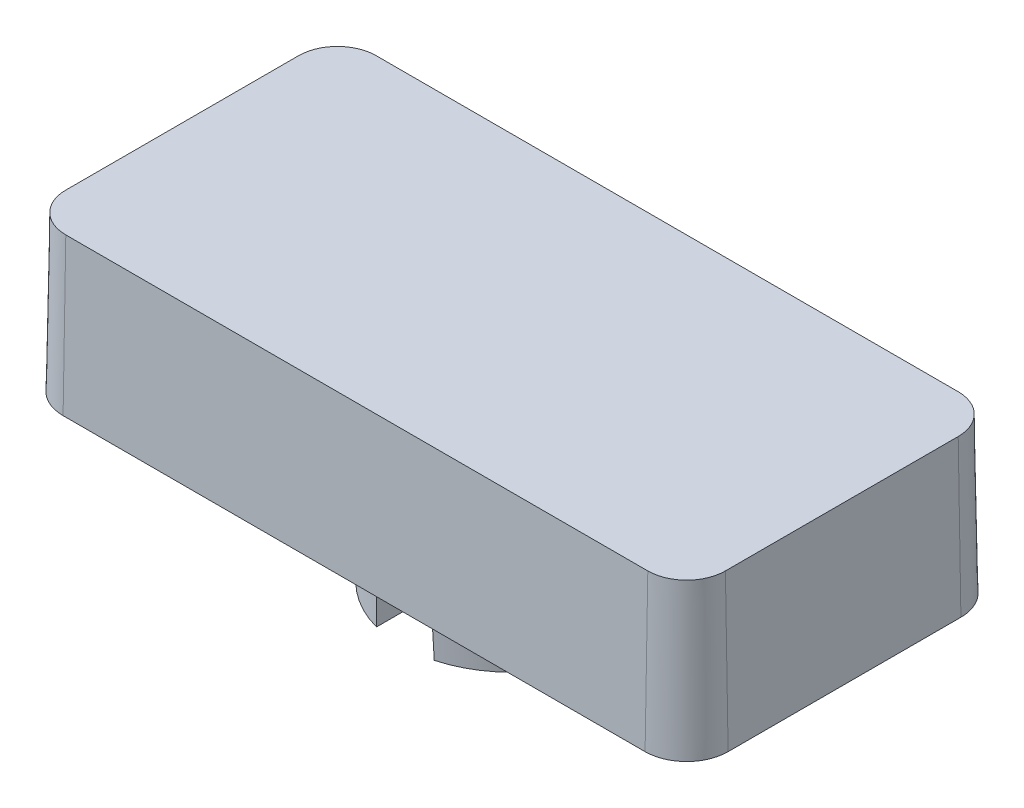
ISO-10303-21;
HEADER;
FILE_DESCRIPTION(('STEP AP214'),'2;1');
FILE_NAME('part.step','',(''),(''),'','','');
FILE_SCHEMA(('AUTOMOTIVE_DESIGN { 1 0 10303 214 1 1 1 1 }'));
ENDSEC;
DATA;
#1=APPLICATION_CONTEXT('core data for automotive mechanical design processes');
#2=APPLICATION_PROTOCOL_DEFINITION('international standard','automotive_design',2000,#1);
#3=PRODUCT_CONTEXT('',#1,'mechanical');
#4=PRODUCT('Part','Part','',(#3));
#5=PRODUCT_RELATED_PRODUCT_CATEGORY('part','',(#4));
#6=PRODUCT_DEFINITION_FORMATION('','',#4);
#7=PRODUCT_DEFINITION_CONTEXT('part definition',#1,'design');
#8=PRODUCT_DEFINITION('design','',#6,#7);
#9=PRODUCT_DEFINITION_SHAPE('','',#8);
#10=(LENGTH_UNIT() NAMED_UNIT(*) SI_UNIT(.MILLI.,.METRE.));
#11=(NAMED_UNIT(*) PLANE_ANGLE_UNIT() SI_UNIT($,.RADIAN.));
#12=(NAMED_UNIT(*) SI_UNIT($,.STERADIAN.) SOLID_ANGLE_UNIT());
#13=UNCERTAINTY_MEASURE_WITH_UNIT(LENGTH_MEASURE(1.E-05),#10,'distance_accuracy_value','');
#14=(GEOMETRIC_REPRESENTATION_CONTEXT(3) GLOBAL_UNCERTAINTY_ASSIGNED_CONTEXT((#13)) GLOBAL_UNIT_ASSIGNED_CONTEXT((#10,
#11,#12)) REPRESENTATION_CONTEXT('',''));
#15=CARTESIAN_POINT('',(0.,0.,0.));
#16=DIRECTION('',(0.,0.,1.));
#17=DIRECTION('',(1.,0.,0.));
#18=AXIS2_PLACEMENT_3D('',#15,#16,#17);
#19=CARTESIAN_POINT('',(-7.5,-0.5,-3.));
#20=DIRECTION('',(0.,-1.,0.));
#21=DIRECTION('',(0.,0.,-1.));
#22=AXIS2_PLACEMENT_3D('',#19,#20,#21);
#23=PLANE('',#22);
#24=DIRECTION('',(0.,0.,1.));
#25=VECTOR('',#24,1.);
#26=CARTESIAN_POINT('',(-0.599999999999999,-0.5,2.93078797989721));
#27=LINE('',#26,#25);
#28=CARTESIAN_POINT('',(-0.599999999999999,-0.5,0.6));
#29=VERTEX_POINT('',#28);
#30=CARTESIAN_POINT('',(-0.599999999999999,-0.5,2.93078797989721));
#31=VERTEX_POINT('',#30);
#32=EDGE_CURVE('E601',#29,#31,#27,.T.);
#33=ORIENTED_EDGE('',*,*,#32,.F.);
#34=DIRECTION('',(1.,0.,0.));
#35=VECTOR('',#34,1.);
#36=CARTESIAN_POINT('',(-2.93078797989721,-0.5,0.6));
#37=LINE('',#36,#35);
#38=CARTESIAN_POINT('',(-2.93078797989721,-0.5,0.6));
#39=VERTEX_POINT('',#38);
#40=EDGE_CURVE('E328',#39,#29,#37,.T.);
#41=ORIENTED_EDGE('',*,*,#40,.F.);
#42=CARTESIAN_POINT('',(0.,-0.5,0.));
#43=DIRECTION('',(0.,-1.,0.));
#44=DIRECTION('',(0.,0.,-1.));
#45=AXIS2_PLACEMENT_3D('',#42,#43,#44);
#46=CIRCLE('',#45,2.99157453243438);
#47=EDGE_CURVE('E598',#31,#39,#46,.T.);
#48=ORIENTED_EDGE('',*,*,#47,.F.);
#49=EDGE_LOOP('',(#33,#41,#48));
#50=FACE_BOUND('',#49,.T.);
#51=CARTESIAN_POINT('',(-7.5,-0.5,-3.));
#52=DIRECTION('',(0.,-1.,0.));
#53=DIRECTION('',(0.,0.,-1.));
#54=AXIS2_PLACEMENT_3D('',#51,#52,#53);
#55=CIRCLE('',#54,0.508651368442155);
#56=CARTESIAN_POINT('',(-7.5,-0.5,-3.50865136844215));
#57=VERTEX_POINT('',#56);
#58=CARTESIAN_POINT('',(-8.00865136844216,-0.5,-3.));
#59=VERTEX_POINT('',#58);
#60=EDGE_CURVE('E564',#57,#59,#55,.F.);
#61=ORIENTED_EDGE('',*,*,#60,.F.);
#62=DIRECTION('',(-1.,0.,0.));
#63=VECTOR('',#62,1.);
#64=CARTESIAN_POINT('',(-7.5,-0.5,-3.50865136844215));
#65=LINE('',#64,#63);
#66=CARTESIAN_POINT('',(7.5,-0.5,-3.50865136844215));
#67=VERTEX_POINT('',#66);
#68=EDGE_CURVE('E559',#67,#57,#65,.T.);
#69=ORIENTED_EDGE('',*,*,#68,.F.);
#70=CARTESIAN_POINT('',(7.5,-0.5,-3.));
#71=DIRECTION('',(0.,-1.,0.));
#72=DIRECTION('',(0.,0.,-1.));
#73=AXIS2_PLACEMENT_3D('',#70,#71,#72);
#74=CIRCLE('',#73,0.508651368442155);
#75=CARTESIAN_POINT('',(8.00865136844216,-0.5,-3.));
#76=VERTEX_POINT('',#75);
#77=EDGE_CURVE('E585',#76,#67,#74,.F.);
#78=ORIENTED_EDGE('',*,*,#77,.F.);
#79=DIRECTION('',(0.,0.,-1.));
#80=VECTOR('',#79,1.);
#81=CARTESIAN_POINT('',(8.00865136844216,-0.5,3.));
#82=LINE('',#81,#80);
#83=CARTESIAN_POINT('',(8.00865136844216,-0.5,3.));
#84=VERTEX_POINT('',#83);
#85=EDGE_CURVE('E580',#84,#76,#82,.T.);
#86=ORIENTED_EDGE('',*,*,#85,.F.);
#87=CARTESIAN_POINT('',(7.5,-0.5,3.));
#88=DIRECTION('',(0.,-1.,0.));
#89=DIRECTION('',(0.,0.,-1.));
#90=AXIS2_PLACEMENT_3D('',#87,#88,#89);
#91=CIRCLE('',#90,0.508651368442155);
#92=CARTESIAN_POINT('',(7.5,-0.5,3.50865136844216));
#93=VERTEX_POINT('',#92);
#94=EDGE_CURVE('E575',#93,#84,#91,.F.);
#95=ORIENTED_EDGE('',*,*,#94,.F.);
#96=DIRECTION('',(1.,0.,0.));
#97=VECTOR('',#96,1.);
#98=CARTESIAN_POINT('',(-7.5,-0.5,3.50865136844216));
#99=LINE('',#98,#97);
#100=CARTESIAN_POINT('',(-7.5,-0.5,3.50865136844216));
#101=VERTEX_POINT('',#100);
#102=EDGE_CURVE('E570',#101,#93,#99,.T.);
#103=ORIENTED_EDGE('',*,*,#102,.F.);
#104=CARTESIAN_POINT('',(-7.5,-0.5,3.));
#105=DIRECTION('',(0.,-1.,0.));
#106=DIRECTION('',(0.,0.,-1.));
#107=AXIS2_PLACEMENT_3D('',#104,#105,#106);
#108=CIRCLE('',#107,0.508651368442155);
#109=CARTESIAN_POINT('',(-8.00865136844216,-0.5,3.));
#110=VERTEX_POINT('',#109);
#111=EDGE_CURVE('E563',#110,#101,#108,.F.);
#112=ORIENTED_EDGE('',*,*,#111,.F.);
#113=DIRECTION('',(0.,0.,1.));
#114=VECTOR('',#113,1.);
#115=CARTESIAN_POINT('',(-8.00865136844216,-0.5,3.));
#116=LINE('',#115,#114);
#117=EDGE_CURVE('E560',#59,#110,#116,.T.);
#118=ORIENTED_EDGE('',*,*,#117,.F.);
#119=EDGE_LOOP('',(#61,#69,#78,#86,#95,#103,#112,#118));
#120=FACE_BOUND('',#119,.T.);
#121=DIRECTION('',(0.,0.,1.));
#122=VECTOR('',#121,1.);
#123=CARTESIAN_POINT('',(-0.599999999999999,-0.5,-0.6));
#124=LINE('',#123,#122);
#125=CARTESIAN_POINT('',(-0.599999999999999,-0.5,-2.93078797989721));
#126=VERTEX_POINT('',#125);
#127=CARTESIAN_POINT('',(-0.599999999999999,-0.5,-0.6));
#128=VERTEX_POINT('',#127);
#129=EDGE_CURVE('E616',#126,#128,#124,.T.);
#130=ORIENTED_EDGE('',*,*,#129,.F.);
#131=CARTESIAN_POINT('',(0.,-0.5,0.));
#132=DIRECTION('',(0.,-1.,0.));
#133=DIRECTION('',(0.,0.,-1.));
#134=AXIS2_PLACEMENT_3D('',#131,#132,#133);
#135=CIRCLE('',#134,2.99157453243438);
#136=CARTESIAN_POINT('',(-2.93078797989721,-0.5,-0.6));
#137=VERTEX_POINT('',#136);
#138=EDGE_CURVE('E292',#137,#126,#135,.T.);
#139=ORIENTED_EDGE('',*,*,#138,.F.);
#140=DIRECTION('',(-1.,0.,0.));
#141=VECTOR('',#140,1.);
#142=CARTESIAN_POINT('',(-2.93078797989721,-0.5,-0.6));
#143=LINE('',#142,#141);
#144=EDGE_CURVE('E330',#128,#137,#143,.T.);
#145=ORIENTED_EDGE('',*,*,#144,.F.);
#146=EDGE_LOOP('',(#130,#139,#145));
#147=FACE_BOUND('',#146,.T.);
#148=DIRECTION('',(0.,0.,-1.));
#149=VECTOR('',#148,1.);
#150=CARTESIAN_POINT('',(0.599999999999999,-0.5,2.93078797989721));
#151=LINE('',#150,#149);
#152=CARTESIAN_POINT('',(0.599999999999999,-0.5,2.93078797989721));
#153=VERTEX_POINT('',#152);
#154=CARTESIAN_POINT('',(0.599999999999999,-0.5,0.6));
#155=VERTEX_POINT('',#154);
#156=EDGE_CURVE('E631',#153,#155,#151,.T.);
#157=ORIENTED_EDGE('',*,*,#156,.F.);
#158=CARTESIAN_POINT('',(0.,-0.5,0.));
#159=DIRECTION('',(0.,-1.,0.));
#160=DIRECTION('',(0.,0.,-1.));
#161=AXIS2_PLACEMENT_3D('',#158,#159,#160);
#162=CIRCLE('',#161,2.99157453243438);
#163=CARTESIAN_POINT('',(2.93078797989721,-0.5,0.6));
#164=VERTEX_POINT('',#163);
#165=EDGE_CURVE('E234',#164,#153,#162,.T.);
#166=ORIENTED_EDGE('',*,*,#165,.F.);
#167=DIRECTION('',(1.,0.,0.));
#168=VECTOR('',#167,1.);
#169=CARTESIAN_POINT('',(0.599999999999999,-0.5,0.6));
#170=LINE('',#169,#168);
#171=EDGE_CURVE('E293',#155,#164,#170,.T.);
#172=ORIENTED_EDGE('',*,*,#171,.F.);
#173=EDGE_LOOP('',(#157,#166,#172));
#174=FACE_BOUND('',#173,.T.);
#175=DIRECTION('',(-1.,0.,0.));
#176=VECTOR('',#175,1.);
#177=CARTESIAN_POINT('',(0.599999999999999,-0.5,-0.6));
#178=LINE('',#177,#176);
#179=CARTESIAN_POINT('',(2.93078797989721,-0.5,-0.6));
#180=VERTEX_POINT('',#179);
#181=CARTESIAN_POINT('',(0.599999999999999,-0.5,-0.6));
#182=VERTEX_POINT('',#181);
#183=EDGE_CURVE('E228',#180,#182,#178,.T.);
#184=ORIENTED_EDGE('',*,*,#183,.F.);
#185=CARTESIAN_POINT('',(0.,-0.5,0.));
#186=DIRECTION('',(0.,-1.,0.));
#187=DIRECTION('',(0.,0.,-1.));
#188=AXIS2_PLACEMENT_3D('',#185,#186,#187);
#189=CIRCLE('',#188,2.99157453243438);
#190=CARTESIAN_POINT('',(0.599999999999999,-0.5,-2.93078797989721));
#191=VERTEX_POINT('',#190);
#192=EDGE_CURVE('E238',#191,#180,#189,.T.);
#193=ORIENTED_EDGE('',*,*,#192,.F.);
#194=DIRECTION('',(0.,0.,-1.));
#195=VECTOR('',#194,1.);
#196=CARTESIAN_POINT('',(0.599999999999999,-0.5,-0.6));
#197=LINE('',#196,#195);
#198=EDGE_CURVE('E244',#182,#191,#197,.T.);
#199=ORIENTED_EDGE('',*,*,#198,.F.);
#200=EDGE_LOOP('',(#184,#193,#199));
#201=FACE_BOUND('',#200,.T.);
#202=ADVANCED_FACE('F38',(#50,#120,#147,#174,#201),#23,.T.);
#203=CARTESIAN_POINT('',(-7.5,-4.,-3.));
#204=DIRECTION('',(0.,-1.,0.));
#205=DIRECTION('',(0.,0.,-1.));
#206=AXIS2_PLACEMENT_3D('',#203,#204,#205);
#207=PLANE('',#206);
#208=CARTESIAN_POINT('',(-7.5,-4.,-3.));
#209=DIRECTION('',(0.,-1.,0.));
#210=DIRECTION('',(0.,0.,-1.));
#211=AXIS2_PLACEMENT_3D('',#208,#209,#210);
#212=CIRCLE('',#211,1.06982025971287);
#213=CARTESIAN_POINT('',(-7.5,-4.,-4.06982025971287));
#214=VERTEX_POINT('',#213);
#215=CARTESIAN_POINT('',(-8.56982025971287,-4.,-3.));
#216=VERTEX_POINT('',#215);
#217=EDGE_CURVE('E478',#214,#216,#212,.F.);
#218=ORIENTED_EDGE('',*,*,#217,.F.);
#219=DIRECTION('',(-1.,0.,0.));
#220=VECTOR('',#219,1.);
#221=CARTESIAN_POINT('',(-7.5,-4.,-4.06982025971287));
#222=LINE('',#221,#220);
#223=CARTESIAN_POINT('',(7.5,-4.,-4.06982025971287));
#224=VERTEX_POINT('',#223);
#225=EDGE_CURVE('E482',#224,#214,#222,.T.);
#226=ORIENTED_EDGE('',*,*,#225,.F.);
#227=CARTESIAN_POINT('',(7.5,-4.,-3.));
#228=DIRECTION('',(0.,-1.,0.));
#229=DIRECTION('',(0.,0.,-1.));
#230=AXIS2_PLACEMENT_3D('',#227,#228,#229);
#231=CIRCLE('',#230,1.06982025971287);
#232=CARTESIAN_POINT('',(8.56982025971287,-4.,-3.));
#233=VERTEX_POINT('',#232);
#234=EDGE_CURVE('E486',#233,#224,#231,.F.);
#235=ORIENTED_EDGE('',*,*,#234,.F.);
#236=DIRECTION('',(0.,0.,-1.));
#237=VECTOR('',#236,1.);
#238=CARTESIAN_POINT('',(8.56982025971287,-4.,3.));
#239=LINE('',#238,#237);
#240=CARTESIAN_POINT('',(8.56982025971287,-4.,3.));
#241=VERTEX_POINT('',#240);
#242=EDGE_CURVE('E488',#241,#233,#239,.T.);
#243=ORIENTED_EDGE('',*,*,#242,.F.);
#244=CARTESIAN_POINT('',(7.5,-4.,3.));
#245=DIRECTION('',(0.,-1.,0.));
#246=DIRECTION('',(0.,0.,-1.));
#247=AXIS2_PLACEMENT_3D('',#244,#245,#246);
#248=CIRCLE('',#247,1.06982025971287);
#249=CARTESIAN_POINT('',(7.5,-4.,4.06982025971287));
#250=VERTEX_POINT('',#249);
#251=EDGE_CURVE('E491',#250,#241,#248,.F.);
#252=ORIENTED_EDGE('',*,*,#251,.F.);
#253=DIRECTION('',(1.,0.,0.));
#254=VECTOR('',#253,1.);
#255=CARTESIAN_POINT('',(-7.5,-4.,4.06982025971287));
#256=LINE('',#255,#254);
#257=CARTESIAN_POINT('',(-7.5,-4.,4.06982025971287));
#258=VERTEX_POINT('',#257);
#259=EDGE_CURVE('E494',#258,#250,#256,.T.);
#260=ORIENTED_EDGE('',*,*,#259,.F.);
#261=CARTESIAN_POINT('',(-7.5,-4.,3.));
#262=DIRECTION('',(0.,-1.,0.));
#263=DIRECTION('',(0.,0.,-1.));
#264=AXIS2_PLACEMENT_3D('',#261,#262,#263);
#265=CIRCLE('',#264,1.06982025971287);
#266=CARTESIAN_POINT('',(-8.56982025971287,-4.,3.));
#267=VERTEX_POINT('',#266);
#268=EDGE_CURVE('E497',#267,#258,#265,.F.);
#269=ORIENTED_EDGE('',*,*,#268,.F.);
#270=DIRECTION('',(0.,0.,1.));
#271=VECTOR('',#270,1.);
#272=CARTESIAN_POINT('',(-8.56982025971287,-4.,3.));
#273=LINE('',#272,#271);
#274=EDGE_CURVE('E481',#216,#267,#273,.T.);
#275=ORIENTED_EDGE('',*,*,#274,.F.);
#276=EDGE_LOOP('',(#218,#226,#235,#243,#252,#260,#269,#275));
#277=FACE_BOUND('',#276,.T.);
#278=DIRECTION('',(-1.,0.,0.));
#279=VECTOR('',#278,1.);
#280=CARTESIAN_POINT('',(-7.5,-4.,-3.56974409569092));
#281=LINE('',#280,#279);
#282=CARTESIAN_POINT('',(7.5,-4.,-3.56974409569091));
#283=VERTEX_POINT('',#282);
#284=CARTESIAN_POINT('',(-7.5,-4.,-3.56974409569092));
#285=VERTEX_POINT('',#284);
#286=EDGE_CURVE('E553',#283,#285,#281,.T.);
#287=ORIENTED_EDGE('',*,*,#286,.T.);
#288=CARTESIAN_POINT('',(-7.5,-4.,-3.));
#289=DIRECTION('',(0.,-1.,0.));
#290=DIRECTION('',(0.,0.,-1.));
#291=AXIS2_PLACEMENT_3D('',#288,#289,#290);
#292=CIRCLE('',#291,0.569744095690917);
#293=CARTESIAN_POINT('',(-8.06974409569092,-4.,-3.));
#294=VERTEX_POINT('',#293);
#295=EDGE_CURVE('E538',#285,#294,#292,.F.);
#296=ORIENTED_EDGE('',*,*,#295,.T.);
#297=DIRECTION('',(0.,0.,1.));
#298=VECTOR('',#297,1.);
#299=CARTESIAN_POINT('',(-8.06974409569092,-4.,3.));
#300=LINE('',#299,#298);
#301=CARTESIAN_POINT('',(-8.06974409569092,-4.,3.));
#302=VERTEX_POINT('',#301);
#303=EDGE_CURVE('E533',#294,#302,#300,.T.);
#304=ORIENTED_EDGE('',*,*,#303,.T.);
#305=CARTESIAN_POINT('',(-7.5,-4.,3.));
#306=DIRECTION('',(0.,-1.,0.));
#307=DIRECTION('',(0.,0.,-1.));
#308=AXIS2_PLACEMENT_3D('',#305,#306,#307);
#309=CIRCLE('',#308,0.569744095690917);
#310=CARTESIAN_POINT('',(-7.5,-4.,3.56974409569092));
#311=VERTEX_POINT('',#310);
#312=EDGE_CURVE('E537',#302,#311,#309,.F.);
#313=ORIENTED_EDGE('',*,*,#312,.T.);
#314=DIRECTION('',(1.,0.,0.));
#315=VECTOR('',#314,1.);
#316=CARTESIAN_POINT('',(-7.5,-4.,3.56974409569092));
#317=LINE('',#316,#315);
#318=CARTESIAN_POINT('',(7.5,-4.,3.56974409569092));
#319=VERTEX_POINT('',#318);
#320=EDGE_CURVE('E541',#311,#319,#317,.T.);
#321=ORIENTED_EDGE('',*,*,#320,.T.);
#322=CARTESIAN_POINT('',(7.5,-4.,3.));
#323=DIRECTION('',(0.,-1.,0.));
#324=DIRECTION('',(0.,0.,-1.));
#325=AXIS2_PLACEMENT_3D('',#322,#323,#324);
#326=CIRCLE('',#325,0.569744095690917);
#327=CARTESIAN_POINT('',(8.06974409569092,-4.,3.));
#328=VERTEX_POINT('',#327);
#329=EDGE_CURVE('E544',#319,#328,#326,.F.);
#330=ORIENTED_EDGE('',*,*,#329,.T.);
#331=DIRECTION('',(0.,0.,-1.));
#332=VECTOR('',#331,1.);
#333=CARTESIAN_POINT('',(8.06974409569092,-4.,3.));
#334=LINE('',#333,#332);
#335=CARTESIAN_POINT('',(8.06974409569092,-4.,-3.));
#336=VERTEX_POINT('',#335);
#337=EDGE_CURVE('E547',#328,#336,#334,.T.);
#338=ORIENTED_EDGE('',*,*,#337,.T.);
#339=CARTESIAN_POINT('',(7.5,-4.,-3.));
#340=DIRECTION('',(0.,-1.,0.));
#341=DIRECTION('',(0.,0.,-1.));
#342=AXIS2_PLACEMENT_3D('',#339,#340,#341);
#343=CIRCLE('',#342,0.569744095690917);
#344=EDGE_CURVE('E550',#336,#283,#343,.F.);
#345=ORIENTED_EDGE('',*,*,#344,.T.);
#346=EDGE_LOOP('',(#287,#296,#304,#313,#321,#330,#338,#345));
#347=FACE_BOUND('',#346,.T.);
#348=ADVANCED_FACE('F417',(#277,#347),#207,.T.);
#349=CARTESIAN_POINT('',(-7.5,0.,-3.));
#350=DIRECTION('',(0.,-1.,0.));
#351=DIRECTION('',(0.,0.,-1.));
#352=AXIS2_PLACEMENT_3D('',#349,#350,#351);
#353=CONICAL_SURFACE('',#352,1.,0.0174532925199433);
#354=CARTESIAN_POINT('',(-7.5,0.,-3.));
#355=DIRECTION('',(0.,1.,0.));
#356=DIRECTION('',(0.,0.,-1.));
#357=AXIS2_PLACEMENT_3D('',#354,#355,#356);
#358=CIRCLE('',#357,1.);
#359=CARTESIAN_POINT('',(-7.5,0.,-4.));
#360=VERTEX_POINT('',#359);
#361=CARTESIAN_POINT('',(-8.5,0.,-3.));
#362=VERTEX_POINT('',#361);
#363=EDGE_CURVE('E526',#360,#362,#358,.T.);
#364=ORIENTED_EDGE('',*,*,#363,.F.);
#365=DIRECTION('',(0.,-0.999847695156391,-0.0174524064372835));
#366=VECTOR('',#365,1.);
#367=CARTESIAN_POINT('',(-7.5,0.,-4.));
#368=LINE('',#367,#366);
#369=EDGE_CURVE('E11',#214,#360,#368,.F.);
#370=ORIENTED_EDGE('',*,*,#369,.F.);
#371=ORIENTED_EDGE('',*,*,#217,.T.);
#372=DIRECTION('',(-0.0174524064372835,-0.999847695156391,0.));
#373=VECTOR('',#372,1.);
#374=CARTESIAN_POINT('',(-8.5,0.,-3.));
#375=LINE('',#374,#373);
#376=EDGE_CURVE('E485',#216,#362,#375,.F.);
#377=ORIENTED_EDGE('',*,*,#376,.T.);
#378=EDGE_LOOP('',(#364,#370,#371,#377));
#379=FACE_BOUND('',#378,.T.);
#380=ADVANCED_FACE('F421',(#379),#353,.T.);
#381=CARTESIAN_POINT('',(-7.5,0.,-4.));
#382=DIRECTION('',(0.,0.0174524064372835,-0.999847695156391));
#383=DIRECTION('',(0.,0.999847695156391,0.0174524064372836));
#384=AXIS2_PLACEMENT_3D('',#381,#382,#383);
#385=PLANE('',#384);
#386=DIRECTION('',(-1.,0.,0.));
#387=VECTOR('',#386,1.);
#388=CARTESIAN_POINT('',(-7.5,0.,-4.));
#389=LINE('',#388,#387);
#390=CARTESIAN_POINT('',(7.5,0.,-4.));
#391=VERTEX_POINT('',#390);
#392=EDGE_CURVE('E463',#391,#360,#389,.T.);
#393=ORIENTED_EDGE('',*,*,#392,.F.);
#394=DIRECTION('',(0.,-0.999847695156391,-0.0174524064372835));
#395=VECTOR('',#394,1.);
#396=CARTESIAN_POINT('',(7.5,0.,-4.));
#397=LINE('',#396,#395);
#398=EDGE_CURVE('E42',#224,#391,#397,.F.);
#399=ORIENTED_EDGE('',*,*,#398,.F.);
#400=ORIENTED_EDGE('',*,*,#225,.T.);
#401=ORIENTED_EDGE('',*,*,#369,.T.);
#402=EDGE_LOOP('',(#393,#399,#400,#401));
#403=FACE_BOUND('',#402,.T.);
#404=ADVANCED_FACE('F40',(#403),#385,.T.);
#405=CARTESIAN_POINT('',(7.5,0.,-3.));
#406=DIRECTION('',(0.,-1.,0.));
#407=DIRECTION('',(0.,0.,1.));
#408=AXIS2_PLACEMENT_3D('',#405,#406,#407);
#409=CONICAL_SURFACE('',#408,1.,0.0174532925199433);
#410=CARTESIAN_POINT('',(7.5,0.,-3.));
#411=DIRECTION('',(0.,1.,0.));
#412=DIRECTION('',(0.,0.,1.));
#413=AXIS2_PLACEMENT_3D('',#410,#411,#412);
#414=CIRCLE('',#413,1.);
#415=CARTESIAN_POINT('',(8.5,0.,-3.));
#416=VERTEX_POINT('',#415);
#417=EDGE_CURVE('E456',#416,#391,#414,.T.);
#418=ORIENTED_EDGE('',*,*,#417,.F.);
#419=DIRECTION('',(0.0174524064372835,-0.999847695156391,0.));
#420=VECTOR('',#419,1.);
#421=CARTESIAN_POINT('',(8.5,0.,-3.));
#422=LINE('',#421,#420);
#423=EDGE_CURVE('E459',#233,#416,#422,.F.);
#424=ORIENTED_EDGE('',*,*,#423,.F.);
#425=ORIENTED_EDGE('',*,*,#234,.T.);
#426=ORIENTED_EDGE('',*,*,#398,.T.);
#427=EDGE_LOOP('',(#418,#424,#425,#426));
#428=FACE_BOUND('',#427,.T.);
#429=ADVANCED_FACE('F447',(#428),#409,.T.);
#430=CARTESIAN_POINT('',(8.5,0.,3.));
#431=DIRECTION('',(0.999847695156391,0.0174524064372835,0.));
#432=DIRECTION('',(-0.0174524064372835,0.999847695156391,0.));
#433=AXIS2_PLACEMENT_3D('',#430,#431,#432);
#434=PLANE('',#433);
#435=DIRECTION('',(0.,0.,-1.));
#436=VECTOR('',#435,1.);
#437=CARTESIAN_POINT('',(8.5,0.,3.));
#438=LINE('',#437,#436);
#439=CARTESIAN_POINT('',(8.5,0.,3.));
#440=VERTEX_POINT('',#439);
#441=EDGE_CURVE('E464',#440,#416,#438,.T.);
#442=ORIENTED_EDGE('',*,*,#441,.F.);
#443=DIRECTION('',(0.0174524064372835,-0.999847695156391,0.));
#444=VECTOR('',#443,1.);
#445=CARTESIAN_POINT('',(8.5,0.,3.));
#446=LINE('',#445,#444);
#447=EDGE_CURVE('E509',#241,#440,#446,.F.);
#448=ORIENTED_EDGE('',*,*,#447,.F.);
#449=ORIENTED_EDGE('',*,*,#242,.T.);
#450=ORIENTED_EDGE('',*,*,#423,.T.);
#451=EDGE_LOOP('',(#442,#448,#449,#450));
#452=FACE_BOUND('',#451,.T.);
#453=ADVANCED_FACE('F444',(#452),#434,.T.);
#454=CARTESIAN_POINT('',(7.5,0.,3.));
#455=DIRECTION('',(0.,-1.,0.));
#456=DIRECTION('',(0.,0.,-1.));
#457=AXIS2_PLACEMENT_3D('',#454,#455,#456);
#458=CONICAL_SURFACE('',#457,1.,0.0174532925199433);
#459=CARTESIAN_POINT('',(7.5,0.,3.));
#460=DIRECTION('',(0.,1.,0.));
#461=DIRECTION('',(0.,0.,-1.));
#462=AXIS2_PLACEMENT_3D('',#459,#460,#461);
#463=CIRCLE('',#462,1.);
#464=CARTESIAN_POINT('',(7.5,0.,4.));
#465=VERTEX_POINT('',#464);
#466=EDGE_CURVE('E471',#465,#440,#463,.T.);
#467=ORIENTED_EDGE('',*,*,#466,.F.);
#468=DIRECTION('',(0.,-0.999847695156391,0.0174524064372835));
#469=VECTOR('',#468,1.);
#470=CARTESIAN_POINT('',(7.5,0.,4.));
#471=LINE('',#470,#469);
#472=EDGE_CURVE('E507',#250,#465,#471,.F.);
#473=ORIENTED_EDGE('',*,*,#472,.F.);
#474=ORIENTED_EDGE('',*,*,#251,.T.);
#475=ORIENTED_EDGE('',*,*,#447,.T.);
#476=EDGE_LOOP('',(#467,#473,#474,#475));
#477=FACE_BOUND('',#476,.T.);
#478=ADVANCED_FACE('F440',(#477),#458,.T.);
#479=CARTESIAN_POINT('',(-7.5,0.,4.));
#480=DIRECTION('',(0.,0.0174524064372835,0.999847695156391));
#481=DIRECTION('',(0.,-0.999847695156391,0.0174524064372836));
#482=AXIS2_PLACEMENT_3D('',#479,#480,#481);
#483=PLANE('',#482);
#484=DIRECTION('',(1.,0.,0.));
#485=VECTOR('',#484,1.);
#486=CARTESIAN_POINT('',(-7.5,0.,4.));
#487=LINE('',#486,#485);
#488=CARTESIAN_POINT('',(-7.5,0.,4.));
#489=VERTEX_POINT('',#488);
#490=EDGE_CURVE('E473',#489,#465,#487,.T.);
#491=ORIENTED_EDGE('',*,*,#490,.F.);
#492=DIRECTION('',(0.,-0.999847695156391,0.0174524064372835));
#493=VECTOR('',#492,1.);
#494=CARTESIAN_POINT('',(-7.5,0.,4.));
#495=LINE('',#494,#493);
#496=EDGE_CURVE('E505',#258,#489,#495,.F.);
#497=ORIENTED_EDGE('',*,*,#496,.F.);
#498=ORIENTED_EDGE('',*,*,#259,.T.);
#499=ORIENTED_EDGE('',*,*,#472,.T.);
#500=EDGE_LOOP('',(#491,#497,#498,#499));
#501=FACE_BOUND('',#500,.T.);
#502=ADVANCED_FACE('F436',(#501),#483,.T.);
#503=CARTESIAN_POINT('',(-7.5,0.,3.));
#504=DIRECTION('',(0.,-1.,0.));
#505=DIRECTION('',(0.,0.,-1.));
#506=AXIS2_PLACEMENT_3D('',#503,#504,#505);
#507=CONICAL_SURFACE('',#506,1.,0.0174532925199433);
#508=CARTESIAN_POINT('',(-7.5,0.,3.));
#509=DIRECTION('',(0.,1.,0.));
#510=DIRECTION('',(0.,0.,-1.));
#511=AXIS2_PLACEMENT_3D('',#508,#509,#510);
#512=CIRCLE('',#511,1.);
#513=CARTESIAN_POINT('',(-8.5,0.,3.));
#514=VERTEX_POINT('',#513);
#515=EDGE_CURVE('E521',#514,#489,#512,.T.);
#516=ORIENTED_EDGE('',*,*,#515,.F.);
#517=DIRECTION('',(-0.0174524064372835,-0.999847695156391,0.));
#518=VECTOR('',#517,1.);
#519=CARTESIAN_POINT('',(-8.5,0.,3.));
#520=LINE('',#519,#518);
#521=EDGE_CURVE('E503',#267,#514,#520,.F.);
#522=ORIENTED_EDGE('',*,*,#521,.F.);
#523=ORIENTED_EDGE('',*,*,#268,.T.);
#524=ORIENTED_EDGE('',*,*,#496,.T.);
#525=EDGE_LOOP('',(#516,#522,#523,#524));
#526=FACE_BOUND('',#525,.T.);
#527=ADVANCED_FACE('F432',(#526),#507,.T.);
#528=CARTESIAN_POINT('',(-8.5,0.,3.));
#529=DIRECTION('',(-0.999847695156391,0.0174524064372835,0.));
#530=DIRECTION('',(-0.0174524064372835,-0.999847695156391,0.));
#531=AXIS2_PLACEMENT_3D('',#528,#529,#530);
#532=PLANE('',#531);
#533=DIRECTION('',(0.,0.,1.));
#534=VECTOR('',#533,1.);
#535=CARTESIAN_POINT('',(-8.5,0.,3.));
#536=LINE('',#535,#534);
#537=EDGE_CURVE('E524',#362,#514,#536,.T.);
#538=ORIENTED_EDGE('',*,*,#537,.F.);
#539=ORIENTED_EDGE('',*,*,#376,.F.);
#540=ORIENTED_EDGE('',*,*,#274,.T.);
#541=ORIENTED_EDGE('',*,*,#521,.T.);
#542=EDGE_LOOP('',(#538,#539,#540,#541));
#543=FACE_BOUND('',#542,.T.);
#544=ADVANCED_FACE('F425',(#543),#532,.T.);
#545=CARTESIAN_POINT('',(-7.5,0.,-3.));
#546=DIRECTION('',(0.,-1.,0.));
#547=DIRECTION('',(0.,0.,-1.));
#548=AXIS2_PLACEMENT_3D('',#545,#546,#547);
#549=PLANE('',#548);
#550=ORIENTED_EDGE('',*,*,#363,.T.);
#551=ORIENTED_EDGE('',*,*,#537,.T.);
#552=ORIENTED_EDGE('',*,*,#515,.T.);
#553=ORIENTED_EDGE('',*,*,#490,.T.);
#554=ORIENTED_EDGE('',*,*,#466,.T.);
#555=ORIENTED_EDGE('',*,*,#441,.T.);
#556=ORIENTED_EDGE('',*,*,#417,.T.);
#557=ORIENTED_EDGE('',*,*,#392,.T.);
#558=EDGE_LOOP('',(#550,#551,#552,#553,#554,#555,#556,#557));
#559=FACE_BOUND('',#558,.T.);
#560=ADVANCED_FACE('F387',(#559),#549,.F.);
#561=CARTESIAN_POINT('',(-7.5,-0.00872620321864177,-3.));
#562=DIRECTION('',(0.,-1.,0.));
#563=DIRECTION('',(0.,0.,-1.));
#564=AXIS2_PLACEMENT_3D('',#561,#562,#563);
#565=CONICAL_SURFACE('',#564,0.500076152421804,0.0174532925199433);
#566=ORIENTED_EDGE('',*,*,#60,.T.);
#567=DIRECTION('',(-0.0174524064372835,-0.999847695156391,0.));
#568=VECTOR('',#567,1.);
#569=CARTESIAN_POINT('',(-8.0000761524218,-0.00872620321864177,-3.));
#570=LINE('',#569,#568);
#571=EDGE_CURVE('E556',#294,#59,#570,.F.);
#572=ORIENTED_EDGE('',*,*,#571,.F.);
#573=ORIENTED_EDGE('',*,*,#295,.F.);
#574=DIRECTION('',(0.,0.999847695156391,0.0174524064372836));
#575=VECTOR('',#574,1.);
#576=CARTESIAN_POINT('',(-7.5,-0.00872620321864177,-3.5000761524218));
#577=LINE('',#576,#575);
#578=EDGE_CURVE('E527',#285,#57,#577,.T.);
#579=ORIENTED_EDGE('',*,*,#578,.T.);
#580=EDGE_LOOP('',(#566,#572,#573,#579));
#581=FACE_BOUND('',#580,.T.);
#582=ADVANCED_FACE('F383',(#581),#565,.F.);
#583=CARTESIAN_POINT('',(-7.5,-0.00872620321864177,-3.5000761524218));
#584=DIRECTION('',(0.,0.0174524064372835,-0.999847695156391));
#585=DIRECTION('',(0.,0.999847695156391,0.0174524064372836));
#586=AXIS2_PLACEMENT_3D('',#583,#584,#585);
#587=PLANE('',#586);
#588=ORIENTED_EDGE('',*,*,#68,.T.);
#589=ORIENTED_EDGE('',*,*,#578,.F.);
#590=ORIENTED_EDGE('',*,*,#286,.F.);
#591=DIRECTION('',(0.,-0.999847695156391,-0.0174524064372835));
#592=VECTOR('',#591,1.);
#593=CARTESIAN_POINT('',(7.5,-0.00872620321864177,-3.5000761524218));
#594=LINE('',#593,#592);
#595=EDGE_CURVE('E530',#283,#67,#594,.F.);
#596=ORIENTED_EDGE('',*,*,#595,.T.);
#597=EDGE_LOOP('',(#588,#589,#590,#596));
#598=FACE_BOUND('',#597,.T.);
#599=ADVANCED_FACE('F386',(#598),#587,.F.);
#600=CARTESIAN_POINT('',(7.5,-0.00872620321864177,-3.));
#601=DIRECTION('',(0.,-1.,0.));
#602=DIRECTION('',(0.,0.,1.));
#603=AXIS2_PLACEMENT_3D('',#600,#601,#602);
#604=CONICAL_SURFACE('',#603,0.500076152421804,0.0174532925199433);
#605=ORIENTED_EDGE('',*,*,#77,.T.);
#606=ORIENTED_EDGE('',*,*,#595,.F.);
#607=ORIENTED_EDGE('',*,*,#344,.F.);
#608=DIRECTION('',(-0.0174524064372835,0.999847695156391,0.));
#609=VECTOR('',#608,1.);
#610=CARTESIAN_POINT('',(8.0000761524218,-0.00872620321864177,-3.));
#611=LINE('',#610,#609);
#612=EDGE_CURVE('E582',#336,#76,#611,.T.);
#613=ORIENTED_EDGE('',*,*,#612,.T.);
#614=EDGE_LOOP('',(#605,#606,#607,#613));
#615=FACE_BOUND('',#614,.T.);
#616=ADVANCED_FACE('F391',(#615),#604,.F.);
#617=CARTESIAN_POINT('',(8.0000761524218,-0.00872620321864177,3.));
#618=DIRECTION('',(0.999847695156391,0.0174524064372835,0.));
#619=DIRECTION('',(-0.0174524064372835,0.999847695156391,0.));
#620=AXIS2_PLACEMENT_3D('',#617,#618,#619);
#621=PLANE('',#620);
#622=ORIENTED_EDGE('',*,*,#85,.T.);
#623=ORIENTED_EDGE('',*,*,#612,.F.);
#624=ORIENTED_EDGE('',*,*,#337,.F.);
#625=DIRECTION('',(0.0174524064372835,-0.999847695156391,0.));
#626=VECTOR('',#625,1.);
#627=CARTESIAN_POINT('',(8.0000761524218,-0.00872620321864177,3.));
#628=LINE('',#627,#626);
#629=EDGE_CURVE('E577',#328,#84,#628,.F.);
#630=ORIENTED_EDGE('',*,*,#629,.T.);
#631=EDGE_LOOP('',(#622,#623,#624,#630));
#632=FACE_BOUND('',#631,.T.);
#633=ADVANCED_FACE('F395',(#632),#621,.F.);
#634=CARTESIAN_POINT('',(7.5,-0.00872620321864177,3.));
#635=DIRECTION('',(0.,-1.,0.));
#636=DIRECTION('',(0.,0.,-1.));
#637=AXIS2_PLACEMENT_3D('',#634,#635,#636);
#638=CONICAL_SURFACE('',#637,0.500076152421804,0.0174532925199433);
#639=ORIENTED_EDGE('',*,*,#94,.T.);
#640=ORIENTED_EDGE('',*,*,#629,.F.);
#641=ORIENTED_EDGE('',*,*,#329,.F.);
#642=DIRECTION('',(0.,-0.999847695156391,0.0174524064372836));
#643=VECTOR('',#642,1.);
#644=CARTESIAN_POINT('',(7.5,-0.00872620321864177,3.50007615242181));
#645=LINE('',#644,#643);
#646=EDGE_CURVE('E572',#319,#93,#645,.F.);
#647=ORIENTED_EDGE('',*,*,#646,.T.);
#648=EDGE_LOOP('',(#639,#640,#641,#647));
#649=FACE_BOUND('',#648,.T.);
#650=ADVANCED_FACE('F399',(#649),#638,.F.);
#651=CARTESIAN_POINT('',(-7.5,-0.00872620321864177,3.50007615242181));
#652=DIRECTION('',(0.,0.0174524064372835,0.999847695156391));
#653=DIRECTION('',(0.,-0.999847695156391,0.0174524064372836));
#654=AXIS2_PLACEMENT_3D('',#651,#652,#653);
#655=PLANE('',#654);
#656=ORIENTED_EDGE('',*,*,#102,.T.);
#657=ORIENTED_EDGE('',*,*,#646,.F.);
#658=ORIENTED_EDGE('',*,*,#320,.F.);
#659=DIRECTION('',(0.,-0.999847695156391,0.0174524064372835));
#660=VECTOR('',#659,1.);
#661=CARTESIAN_POINT('',(-7.5,-0.00872620321864177,3.50007615242181));
#662=LINE('',#661,#660);
#663=EDGE_CURVE('E567',#311,#101,#662,.F.);
#664=ORIENTED_EDGE('',*,*,#663,.T.);
#665=EDGE_LOOP('',(#656,#657,#658,#664));
#666=FACE_BOUND('',#665,.T.);
#667=ADVANCED_FACE('F403',(#666),#655,.F.);
#668=CARTESIAN_POINT('',(-7.5,-0.00872620321864177,3.));
#669=DIRECTION('',(0.,-1.,0.));
#670=DIRECTION('',(0.,0.,-1.));
#671=AXIS2_PLACEMENT_3D('',#668,#669,#670);
#672=CONICAL_SURFACE('',#671,0.500076152421804,0.0174532925199433);
#673=ORIENTED_EDGE('',*,*,#111,.T.);
#674=ORIENTED_EDGE('',*,*,#663,.F.);
#675=ORIENTED_EDGE('',*,*,#312,.F.);
#676=DIRECTION('',(-0.0174524064372835,-0.999847695156391,0.));
#677=VECTOR('',#676,1.);
#678=CARTESIAN_POINT('',(-8.0000761524218,-0.00872620321864177,3.));
#679=LINE('',#678,#677);
#680=EDGE_CURVE('E565',#302,#110,#679,.F.);
#681=ORIENTED_EDGE('',*,*,#680,.T.);
#682=EDGE_LOOP('',(#673,#674,#675,#681));
#683=FACE_BOUND('',#682,.T.);
#684=ADVANCED_FACE('F407',(#683),#672,.F.);
#685=CARTESIAN_POINT('',(-8.0000761524218,-0.00872620321864177,3.));
#686=DIRECTION('',(-0.999847695156391,0.0174524064372835,0.));
#687=DIRECTION('',(-0.0174524064372835,-0.999847695156391,0.));
#688=AXIS2_PLACEMENT_3D('',#685,#686,#687);
#689=PLANE('',#688);
#690=ORIENTED_EDGE('',*,*,#117,.T.);
#691=ORIENTED_EDGE('',*,*,#680,.F.);
#692=ORIENTED_EDGE('',*,*,#303,.F.);
#693=ORIENTED_EDGE('',*,*,#571,.T.);
#694=EDGE_LOOP('',(#690,#691,#692,#693));
#695=FACE_BOUND('',#694,.T.);
#696=ADVANCED_FACE('F355',(#695),#689,.F.);
#697=CARTESIAN_POINT('',(-2.93078797989721,-0.5,0.6));
#698=DIRECTION('',(0.,-0.0261769483078732,-0.999657324975557));
#699=DIRECTION('',(0.,0.999657324975557,-0.0261769483078732));
#700=AXIS2_PLACEMENT_3D('',#697,#698,#699);
#701=PLANE('',#700);
#702=ORIENTED_EDGE('',*,*,#40,.T.);
#703=DIRECTION('',(0.0261679842649794,0.99931500198837,-0.0261679842649794));
#704=VECTOR('',#703,1.);
#705=CARTESIAN_POINT('',(-0.60159603830294,-0.560950243768348,0.601596038302941));
#706=LINE('',#705,#704);
#707=CARTESIAN_POINT('',(-0.744022568630528,-6.,0.744022568630528));
#708=VERTEX_POINT('',#707);
#709=EDGE_CURVE('E370',#708,#29,#706,.T.);
#710=ORIENTED_EDGE('',*,*,#709,.F.);
#711=DIRECTION('',(-1.,0.,0.));
#712=VECTOR('',#711,1.);
#713=CARTESIAN_POINT('',(-2.93078797989721,-6.,0.744022568630528));
#714=LINE('',#713,#712);
#715=CARTESIAN_POINT('',(-2.74863286088405,-6.,0.744022568630528));
#716=VERTEX_POINT('',#715);
#717=EDGE_CURVE('E377',#716,#708,#714,.F.);
#718=ORIENTED_EDGE('',*,*,#717,.F.);
#719=CARTESIAN_POINT('',(-2.74863286088405,-6.,0.744022568630528));
#720=CARTESIAN_POINT('',(-2.77996443714949,-5.08336550958536,0.720019649756919));
#721=CARTESIAN_POINT('',(-2.81080981863525,-4.16671492786495,0.696016309517639));
#722=CARTESIAN_POINT('',(-2.87152819162615,-2.33338159453117,0.648008786640784));
#723=CARTESIAN_POINT('',(-2.90140118314478,-1.41669884291825,0.624004604003222));
#724=CARTESIAN_POINT('',(-2.93078797989721,-0.500000000000001,0.6));
#725=B_SPLINE_CURVE_WITH_KNOTS('',3,(#719,#720,#721,#722,#723,#724),.UNSPECIFIED.,.F.,.F.,(4,2,
4),(0.,2.75245035955785,5.50490068092589),.UNSPECIFIED.);
#726=EDGE_CURVE('E360',#716,#39,#725,.T.);
#727=ORIENTED_EDGE('',*,*,#726,.T.);
#728=EDGE_LOOP('',(#702,#710,#718,#727));
#729=FACE_BOUND('',#728,.T.);
#730=ADVANCED_FACE('F350',(#729),#701,.T.);
#731=CARTESIAN_POINT('',(-0.599999999999999,-0.5,2.93078797989721));
#732=DIRECTION('',(0.999657324975557,-0.0261769483078732,0.));
#733=DIRECTION('',(0.0261769483078732,0.999657324975557,0.));
#734=AXIS2_PLACEMENT_3D('',#731,#732,#733);
#735=PLANE('',#734);
#736=ORIENTED_EDGE('',*,*,#32,.T.);
#737=CARTESIAN_POINT('',(-0.744022568630528,-6.,2.74863286088405));
#738=CARTESIAN_POINT('',(-0.720019649756918,-5.08336550958536,2.7799644371495));
#739=CARTESIAN_POINT('',(-0.696016309517638,-4.16671492786495,2.81080981863525));
#740=CARTESIAN_POINT('',(-0.648008786640783,-2.33338159453117,2.87152819162615));
#741=CARTESIAN_POINT('',(-0.624004604003221,-1.41669884291825,2.90140118314478));
#742=CARTESIAN_POINT('',(-0.599999999999999,-0.500000000000001,2.93078797989721));
#743=B_SPLINE_CURVE_WITH_KNOTS('',3,(#737,#738,#739,#740,#741,#742),.UNSPECIFIED.,.F.,.F.,(4,2,
4),(0.,2.75245035955785,5.50490068092589),.UNSPECIFIED.);
#744=CARTESIAN_POINT('',(-0.744022568630528,-6.,2.74863286088405));
#745=VERTEX_POINT('',#744);
#746=EDGE_CURVE('E368',#745,#31,#743,.T.);
#747=ORIENTED_EDGE('',*,*,#746,.F.);
#748=DIRECTION('',(0.,0.,-1.));
#749=VECTOR('',#748,1.);
#750=CARTESIAN_POINT('',(-0.744022568630528,-6.,2.93078797989721));
#751=LINE('',#750,#749);
#752=EDGE_CURVE('E595',#708,#745,#751,.F.);
#753=ORIENTED_EDGE('',*,*,#752,.F.);
#754=ORIENTED_EDGE('',*,*,#709,.T.);
#755=EDGE_LOOP('',(#736,#747,#753,#754));
#756=FACE_BOUND('',#755,.T.);
#757=ADVANCED_FACE('F354',(#756),#735,.T.);
#758=CARTESIAN_POINT('',(0.,-0.5,0.));
#759=DIRECTION('',(0.,1.,0.));
#760=DIRECTION('',(0.,0.,-1.));
#761=AXIS2_PLACEMENT_3D('',#758,#759,#760);
#762=CONICAL_SURFACE('',#761,2.99157453243438,0.026179938779915);
#763=ORIENTED_EDGE('',*,*,#47,.T.);
#764=ORIENTED_EDGE('',*,*,#726,.F.);
#765=CARTESIAN_POINT('',(0.,-6.,0.));
#766=DIRECTION('',(0.,-1.,0.));
#767=DIRECTION('',(0.,0.,-1.));
#768=AXIS2_PLACEMENT_3D('',#765,#766,#767);
#769=CIRCLE('',#768,2.84755196380385);
#770=EDGE_CURVE('E369',#745,#716,#769,.T.);
#771=ORIENTED_EDGE('',*,*,#770,.F.);
#772=ORIENTED_EDGE('',*,*,#746,.T.);
#773=EDGE_LOOP('',(#763,#764,#771,#772));
#774=FACE_BOUND('',#773,.T.);
#775=ADVANCED_FACE('F348',(#774),#762,.T.);
#776=CARTESIAN_POINT('',(0.,-6.,0.));
#777=DIRECTION('',(0.,-1.,0.));
#778=DIRECTION('',(0.,0.,-1.));
#779=AXIS2_PLACEMENT_3D('',#776,#777,#778);
#780=PLANE('',#779);
#781=ORIENTED_EDGE('',*,*,#717,.T.);
#782=ORIENTED_EDGE('',*,*,#752,.T.);
#783=ORIENTED_EDGE('',*,*,#770,.T.);
#784=EDGE_LOOP('',(#781,#782,#783));
#785=FACE_BOUND('',#784,.T.);
#786=ADVANCED_FACE('F345',(#785),#780,.T.);
#787=CARTESIAN_POINT('',(0.,-0.5,0.));
#788=DIRECTION('',(0.,1.,0.));
#789=DIRECTION('',(0.,0.,-1.));
#790=AXIS2_PLACEMENT_3D('',#787,#788,#789);
#791=CONICAL_SURFACE('',#790,2.99157453243438,0.026179938779915);
#792=ORIENTED_EDGE('',*,*,#138,.T.);
#793=CARTESIAN_POINT('',(-0.744022568630528,-6.,-2.74863286088405));
#794=CARTESIAN_POINT('',(-0.720019649756918,-5.08336550958536,-2.7799644371495));
#795=CARTESIAN_POINT('',(-0.696016309517638,-4.16671492786495,-2.81080981863525));
#796=CARTESIAN_POINT('',(-0.648008786640783,-2.33338159453117,-2.87152819162615));
#797=CARTESIAN_POINT('',(-0.624004604003221,-1.41669884291825,-2.90140118314478));
#798=CARTESIAN_POINT('',(-0.599999999999999,-0.500000000000001,-2.93078797989721));
#799=B_SPLINE_CURVE_WITH_KNOTS('',3,(#793,#794,#795,#796,#797,#798),.UNSPECIFIED.,.F.,.F.,(4,2,
4),(0.,2.75245035955785,5.50490068092589),.UNSPECIFIED.);
#800=CARTESIAN_POINT('',(-0.744022568630528,-6.,-2.74863286088405));
#801=VERTEX_POINT('',#800);
#802=EDGE_CURVE('E321',#801,#126,#799,.T.);
#803=ORIENTED_EDGE('',*,*,#802,.F.);
#804=CARTESIAN_POINT('',(0.,-6.,0.));
#805=DIRECTION('',(0.,-1.,0.));
#806=DIRECTION('',(0.,0.,-1.));
#807=AXIS2_PLACEMENT_3D('',#804,#805,#806);
#808=CIRCLE('',#807,2.84755196380385);
#809=CARTESIAN_POINT('',(-2.74863286088405,-6.,-0.744022568630528));
#810=VERTEX_POINT('',#809);
#811=EDGE_CURVE('E612',#810,#801,#808,.T.);
#812=ORIENTED_EDGE('',*,*,#811,.F.);
#813=CARTESIAN_POINT('',(-2.74863286088405,-6.,-0.744022568630528));
#814=CARTESIAN_POINT('',(-2.77996443714949,-5.08336550958536,-0.720019649756919));
#815=CARTESIAN_POINT('',(-2.81080981863525,-4.16671492786495,-0.696016309517639));
#816=CARTESIAN_POINT('',(-2.87152819162615,-2.33338159453117,-0.648008786640784));
#817=CARTESIAN_POINT('',(-2.90140118314478,-1.41669884291825,-0.624004604003222));
#818=CARTESIAN_POINT('',(-2.93078797989721,-0.500000000000001,-0.6));
#819=B_SPLINE_CURVE_WITH_KNOTS('',3,(#813,#814,#815,#816,#817,#818),.UNSPECIFIED.,.F.,.F.,(4,2,
4),(0.,2.75245035955785,5.50490068092589),.UNSPECIFIED.);
#820=EDGE_CURVE('E332',#810,#137,#819,.T.);
#821=ORIENTED_EDGE('',*,*,#820,.T.);
#822=EDGE_LOOP('',(#792,#803,#812,#821));
#823=FACE_BOUND('',#822,.T.);
#824=ADVANCED_FACE('F316',(#823),#791,.T.);
#825=CARTESIAN_POINT('',(-0.599999999999999,-0.5,-0.6));
#826=DIRECTION('',(0.999657324975557,-0.0261769483078732,0.));
#827=DIRECTION('',(0.0261769483078732,0.999657324975557,0.));
#828=AXIS2_PLACEMENT_3D('',#825,#826,#827);
#829=PLANE('',#828);
#830=ORIENTED_EDGE('',*,*,#129,.T.);
#831=DIRECTION('',(0.0261679842649794,0.99931500198837,0.0261679842649794));
#832=VECTOR('',#831,1.);
#833=CARTESIAN_POINT('',(-0.601596038302941,-0.560950243768348,-0.601596038302941));
#834=LINE('',#833,#832);
#835=CARTESIAN_POINT('',(-0.744022568630528,-6.,-0.744022568630528));
#836=VERTEX_POINT('',#835);
#837=EDGE_CURVE('E329',#836,#128,#834,.T.);
#838=ORIENTED_EDGE('',*,*,#837,.F.);
#839=DIRECTION('',(0.,0.,-1.));
#840=VECTOR('',#839,1.);
#841=CARTESIAN_POINT('',(-0.744022568630528,-6.,-0.6));
#842=LINE('',#841,#840);
#843=EDGE_CURVE('E611',#801,#836,#842,.F.);
#844=ORIENTED_EDGE('',*,*,#843,.F.);
#845=ORIENTED_EDGE('',*,*,#802,.T.);
#846=EDGE_LOOP('',(#830,#838,#844,#845));
#847=FACE_BOUND('',#846,.T.);
#848=ADVANCED_FACE('F312',(#847),#829,.T.);
#849=CARTESIAN_POINT('',(-2.93078797989721,-0.5,-0.6));
#850=DIRECTION('',(0.,-0.0261769483078732,0.999657324975557));
#851=DIRECTION('',(0.,-0.999657324975557,-0.0261769483078732));
#852=AXIS2_PLACEMENT_3D('',#849,#850,#851);
#853=PLANE('',#852);
#854=ORIENTED_EDGE('',*,*,#144,.T.);
#855=ORIENTED_EDGE('',*,*,#820,.F.);
#856=DIRECTION('',(1.,0.,0.));
#857=VECTOR('',#856,1.);
#858=CARTESIAN_POINT('',(-2.93078797989721,-6.,-0.744022568630528));
#859=LINE('',#858,#857);
#860=EDGE_CURVE('E339',#836,#810,#859,.F.);
#861=ORIENTED_EDGE('',*,*,#860,.F.);
#862=ORIENTED_EDGE('',*,*,#837,.T.);
#863=EDGE_LOOP('',(#854,#855,#861,#862));
#864=FACE_BOUND('',#863,.T.);
#865=ADVANCED_FACE('F310',(#864),#853,.T.);
#866=CARTESIAN_POINT('',(0.,-6.,0.));
#867=DIRECTION('',(0.,-1.,0.));
#868=DIRECTION('',(0.,0.,-1.));
#869=AXIS2_PLACEMENT_3D('',#866,#867,#868);
#870=PLANE('',#869);
#871=ORIENTED_EDGE('',*,*,#811,.T.);
#872=ORIENTED_EDGE('',*,*,#843,.T.);
#873=ORIENTED_EDGE('',*,*,#860,.T.);
#874=EDGE_LOOP('',(#871,#872,#873));
#875=FACE_BOUND('',#874,.T.);
#876=ADVANCED_FACE('F307',(#875),#870,.T.);
#877=CARTESIAN_POINT('',(0.,-0.5,0.));
#878=DIRECTION('',(0.,1.,0.));
#879=DIRECTION('',(0.,0.,-1.));
#880=AXIS2_PLACEMENT_3D('',#877,#878,#879);
#881=CONICAL_SURFACE('',#880,2.99157453243438,0.026179938779915);
#882=ORIENTED_EDGE('',*,*,#165,.T.);
#883=CARTESIAN_POINT('',(0.744022568630528,-6.,2.74863286088405));
#884=CARTESIAN_POINT('',(0.720019649756918,-5.08336550958536,2.77996443714949));
#885=CARTESIAN_POINT('',(0.696016309517638,-4.16671492786495,2.81080981863525));
#886=CARTESIAN_POINT('',(0.648008786640783,-2.33338159453117,2.87152819162615));
#887=CARTESIAN_POINT('',(0.624004604003221,-1.41669884291825,2.90140118314478));
#888=CARTESIAN_POINT('',(0.599999999999999,-0.500000000000001,2.93078797989721));
#889=B_SPLINE_CURVE_WITH_KNOTS('',3,(#883,#884,#885,#886,#887,#888),.UNSPECIFIED.,.F.,.F.,(4,2,
4),(0.,2.75245035955785,5.50490068092589),.UNSPECIFIED.);
#890=CARTESIAN_POINT('',(0.744022568630528,-6.,2.74863286088405));
#891=VERTEX_POINT('',#890);
#892=EDGE_CURVE('E285',#891,#153,#889,.T.);
#893=ORIENTED_EDGE('',*,*,#892,.F.);
#894=CARTESIAN_POINT('',(0.,-6.,0.));
#895=DIRECTION('',(0.,-1.,0.));
#896=DIRECTION('',(0.,0.,-1.));
#897=AXIS2_PLACEMENT_3D('',#894,#895,#896);
#898=CIRCLE('',#897,2.84755196380385);
#899=CARTESIAN_POINT('',(2.74863286088405,-6.,0.744022568630528));
#900=VERTEX_POINT('',#899);
#901=EDGE_CURVE('E627',#900,#891,#898,.T.);
#902=ORIENTED_EDGE('',*,*,#901,.F.);
#903=CARTESIAN_POINT('',(2.74863286088405,-6.,0.744022568630528));
#904=CARTESIAN_POINT('',(2.77996443714949,-5.08336550958536,0.720019649756919));
#905=CARTESIAN_POINT('',(2.81080981863525,-4.16671492786495,0.696016309517639));
#906=CARTESIAN_POINT('',(2.87152819162615,-2.33338159453117,0.648008786640784));
#907=CARTESIAN_POINT('',(2.90140118314478,-1.41669884291825,0.624004604003222));
#908=CARTESIAN_POINT('',(2.93078797989721,-0.500000000000001,0.6));
#909=B_SPLINE_CURVE_WITH_KNOTS('',3,(#903,#904,#905,#906,#907,#908),.UNSPECIFIED.,.F.,.F.,(4,2,
4),(0.,2.75245035955785,5.50490068092589),.UNSPECIFIED.);
#910=EDGE_CURVE('E295',#900,#164,#909,.T.);
#911=ORIENTED_EDGE('',*,*,#910,.T.);
#912=EDGE_LOOP('',(#882,#893,#902,#911));
#913=FACE_BOUND('',#912,.T.);
#914=ADVANCED_FACE('F280',(#913),#881,.T.);
#915=CARTESIAN_POINT('',(0.599999999999999,-0.5,2.93078797989721));
#916=DIRECTION('',(-0.999657324975557,-0.0261769483078732,0.));
#917=DIRECTION('',(0.0261769483078732,-0.999657324975557,0.));
#918=AXIS2_PLACEMENT_3D('',#915,#916,#917);
#919=PLANE('',#918);
#920=ORIENTED_EDGE('',*,*,#156,.T.);
#921=DIRECTION('',(-0.0261679842649794,0.99931500198837,-0.0261679842649794));
#922=VECTOR('',#921,1.);
#923=CARTESIAN_POINT('',(0.599999999999999,-0.5,0.6));
#924=LINE('',#923,#922);
#925=CARTESIAN_POINT('',(0.744022568630528,-6.,0.744022568630528));
#926=VERTEX_POINT('',#925);
#927=EDGE_CURVE('E62',#926,#155,#924,.T.);
#928=ORIENTED_EDGE('',*,*,#927,.F.);
#929=DIRECTION('',(0.,0.,1.));
#930=VECTOR('',#929,1.);
#931=CARTESIAN_POINT('',(0.744022568630528,-6.,2.93078797989721));
#932=LINE('',#931,#930);
#933=EDGE_CURVE('E626',#891,#926,#932,.F.);
#934=ORIENTED_EDGE('',*,*,#933,.F.);
#935=ORIENTED_EDGE('',*,*,#892,.T.);
#936=EDGE_LOOP('',(#920,#928,#934,#935));
#937=FACE_BOUND('',#936,.T.);
#938=ADVANCED_FACE('F276',(#937),#919,.T.);
#939=CARTESIAN_POINT('',(0.599999999999999,-0.5,0.6));
#940=DIRECTION('',(0.,-0.0261769483078732,-0.999657324975557));
#941=DIRECTION('',(0.,0.999657324975557,-0.0261769483078732));
#942=AXIS2_PLACEMENT_3D('',#939,#940,#941);
#943=PLANE('',#942);
#944=ORIENTED_EDGE('',*,*,#171,.T.);
#945=ORIENTED_EDGE('',*,*,#910,.F.);
#946=DIRECTION('',(-1.,0.,0.));
#947=VECTOR('',#946,1.);
#948=CARTESIAN_POINT('',(0.599999999999999,-6.,0.744022568630528));
#949=LINE('',#948,#947);
#950=EDGE_CURVE('E302',#926,#900,#949,.F.);
#951=ORIENTED_EDGE('',*,*,#950,.F.);
#952=ORIENTED_EDGE('',*,*,#927,.T.);
#953=EDGE_LOOP('',(#944,#945,#951,#952));
#954=FACE_BOUND('',#953,.T.);
#955=ADVANCED_FACE('F274',(#954),#943,.T.);
#956=CARTESIAN_POINT('',(0.,-6.,0.));
#957=DIRECTION('',(0.,-1.,0.));
#958=DIRECTION('',(0.,0.,-1.));
#959=AXIS2_PLACEMENT_3D('',#956,#957,#958);
#960=PLANE('',#959);
#961=ORIENTED_EDGE('',*,*,#901,.T.);
#962=ORIENTED_EDGE('',*,*,#933,.T.);
#963=ORIENTED_EDGE('',*,*,#950,.T.);
#964=EDGE_LOOP('',(#961,#962,#963));
#965=FACE_BOUND('',#964,.T.);
#966=ADVANCED_FACE('F265',(#965),#960,.T.);
#967=CARTESIAN_POINT('',(0.,-0.5,0.));
#968=DIRECTION('',(0.,1.,0.));
#969=DIRECTION('',(0.,0.,-1.));
#970=AXIS2_PLACEMENT_3D('',#967,#968,#969);
#971=CONICAL_SURFACE('',#970,2.99157453243438,0.026179938779915);
#972=ORIENTED_EDGE('',*,*,#192,.T.);
#973=CARTESIAN_POINT('',(2.74863286088405,-6.,-0.744022568630528));
#974=CARTESIAN_POINT('',(2.77996443714949,-5.08336550958536,-0.720019649756919));
#975=CARTESIAN_POINT('',(2.81080981863525,-4.16671492786495,-0.696016309517639));
#976=CARTESIAN_POINT('',(2.87152819162615,-2.33338159453117,-0.648008786640784));
#977=CARTESIAN_POINT('',(2.90140118314478,-1.41669884291825,-0.624004604003222));
#978=CARTESIAN_POINT('',(2.93078797989721,-0.500000000000001,-0.6));
#979=B_SPLINE_CURVE_WITH_KNOTS('',3,(#973,#974,#975,#976,#977,#978),.UNSPECIFIED.,.F.,.F.,(4,2,
4),(0.,2.75245035955785,5.50490068092589),.UNSPECIFIED.);
#980=CARTESIAN_POINT('',(2.74863286088405,-6.,-0.744022568630528));
#981=VERTEX_POINT('',#980);
#982=EDGE_CURVE('E224',#981,#180,#979,.T.);
#983=ORIENTED_EDGE('',*,*,#982,.F.);
#984=CARTESIAN_POINT('',(0.,-6.,0.));
#985=DIRECTION('',(0.,-1.,0.));
#986=DIRECTION('',(0.,0.,-1.));
#987=AXIS2_PLACEMENT_3D('',#984,#985,#986);
#988=CIRCLE('',#987,2.84755196380385);
#989=CARTESIAN_POINT('',(0.744022568630528,-6.,-2.74863286088405));
#990=VERTEX_POINT('',#989);
#991=EDGE_CURVE('E246',#990,#981,#988,.T.);
#992=ORIENTED_EDGE('',*,*,#991,.F.);
#993=CARTESIAN_POINT('',(0.744022568630528,-6.,-2.74863286088405));
#994=CARTESIAN_POINT('',(0.720019649756918,-5.08336550958536,-2.77996443714949));
#995=CARTESIAN_POINT('',(0.696016309517638,-4.16671492786495,-2.81080981863525));
#996=CARTESIAN_POINT('',(0.648008786640783,-2.33338159453117,-2.87152819162615));
#997=CARTESIAN_POINT('',(0.624004604003221,-1.41669884291825,-2.90140118314478));
#998=CARTESIAN_POINT('',(0.599999999999999,-0.500000000000001,-2.93078797989721));
#999=B_SPLINE_CURVE_WITH_KNOTS('',3,(#993,#994,#995,#996,#997,#998),.UNSPECIFIED.,.F.,.F.,(4,2,
4),(0.,2.75245035955785,5.50490068092589),.UNSPECIFIED.);
#1000=EDGE_CURVE('E241',#990,#191,#999,.T.);
#1001=ORIENTED_EDGE('',*,*,#1000,.T.);
#1002=EDGE_LOOP('',(#972,#983,#992,#1001));
#1003=FACE_BOUND('',#1002,.T.);
#1004=ADVANCED_FACE('F239',(#1003),#971,.T.);
#1005=CARTESIAN_POINT('',(0.599999999999999,-0.5,-0.6));
#1006=DIRECTION('',(0.,-0.0261769483078732,0.999657324975557));
#1007=DIRECTION('',(0.,-0.999657324975557,-0.0261769483078732));
#1008=AXIS2_PLACEMENT_3D('',#1005,#1006,#1007);
#1009=PLANE('',#1008);
#1010=ORIENTED_EDGE('',*,*,#183,.T.);
#1011=DIRECTION('',(-0.0261679842649794,0.99931500198837,0.0261679842649794));
#1012=VECTOR('',#1011,1.);
#1013=CARTESIAN_POINT('',(0.599999999999999,-0.5,-0.6));
#1014=LINE('',#1013,#1012);
#1015=CARTESIAN_POINT('',(0.744022568630528,-6.,-0.744022568630528));
#1016=VERTEX_POINT('',#1015);
#1017=EDGE_CURVE('E54',#1016,#182,#1014,.T.);
#1018=ORIENTED_EDGE('',*,*,#1017,.F.);
#1019=DIRECTION('',(1.,0.,0.));
#1020=VECTOR('',#1019,1.);
#1021=CARTESIAN_POINT('',(0.599999999999999,-6.,-0.744022568630528));
#1022=LINE('',#1021,#1020);
#1023=EDGE_CURVE('E230',#981,#1016,#1022,.F.);
#1024=ORIENTED_EDGE('',*,*,#1023,.F.);
#1025=ORIENTED_EDGE('',*,*,#982,.T.);
#1026=EDGE_LOOP('',(#1010,#1018,#1024,#1025));
#1027=FACE_BOUND('',#1026,.T.);
#1028=ADVANCED_FACE('F226',(#1027),#1009,.T.);
#1029=CARTESIAN_POINT('',(0.599999999999999,-0.5,-0.6));
#1030=DIRECTION('',(-0.999657324975557,-0.0261769483078732,0.));
#1031=DIRECTION('',(0.0261769483078732,-0.999657324975557,0.));
#1032=AXIS2_PLACEMENT_3D('',#1029,#1030,#1031);
#1033=PLANE('',#1032);
#1034=ORIENTED_EDGE('',*,*,#198,.T.);
#1035=ORIENTED_EDGE('',*,*,#1000,.F.);
#1036=DIRECTION('',(0.,0.,1.));
#1037=VECTOR('',#1036,1.);
#1038=CARTESIAN_POINT('',(0.744022568630528,-6.,-0.6));
#1039=LINE('',#1038,#1037);
#1040=EDGE_CURVE('E638',#1016,#990,#1039,.F.);
#1041=ORIENTED_EDGE('',*,*,#1040,.F.);
#1042=ORIENTED_EDGE('',*,*,#1017,.T.);
#1043=EDGE_LOOP('',(#1034,#1035,#1041,#1042));
#1044=FACE_BOUND('',#1043,.T.);
#1045=ADVANCED_FACE('F266',(#1044),#1033,.T.);
#1046=CARTESIAN_POINT('',(0.,-6.,0.));
#1047=DIRECTION('',(0.,-1.,0.));
#1048=DIRECTION('',(0.,0.,-1.));
#1049=AXIS2_PLACEMENT_3D('',#1046,#1047,#1048);
#1050=PLANE('',#1049);
#1051=ORIENTED_EDGE('',*,*,#991,.T.);
#1052=ORIENTED_EDGE('',*,*,#1023,.T.);
#1053=ORIENTED_EDGE('',*,*,#1040,.T.);
#1054=EDGE_LOOP('',(#1051,#1052,#1053));
#1055=FACE_BOUND('',#1054,.T.);
#1056=ADVANCED_FACE('F271',(#1055),#1050,.T.);
#1057=CLOSED_SHELL('',(#202,#348,#380,#404,#429,#453,#478,#502,#527,#544,#560,#582,#599,#616,
#633,#650,#667,#684,#696,#730,#757,#775,#786,#824,#848,#865,#876,#914,#938,#955,#966,#1004,
#1028,#1045,#1056));
#1058=MANIFOLD_SOLID_BREP('B2',#1057);
#1059=ADVANCED_BREP_SHAPE_REPRESENTATION('',(#18,#1058),#14);
#1060=SHAPE_DEFINITION_REPRESENTATION(#9,#1059);
ENDSEC;
END-ISO-10303-21;
